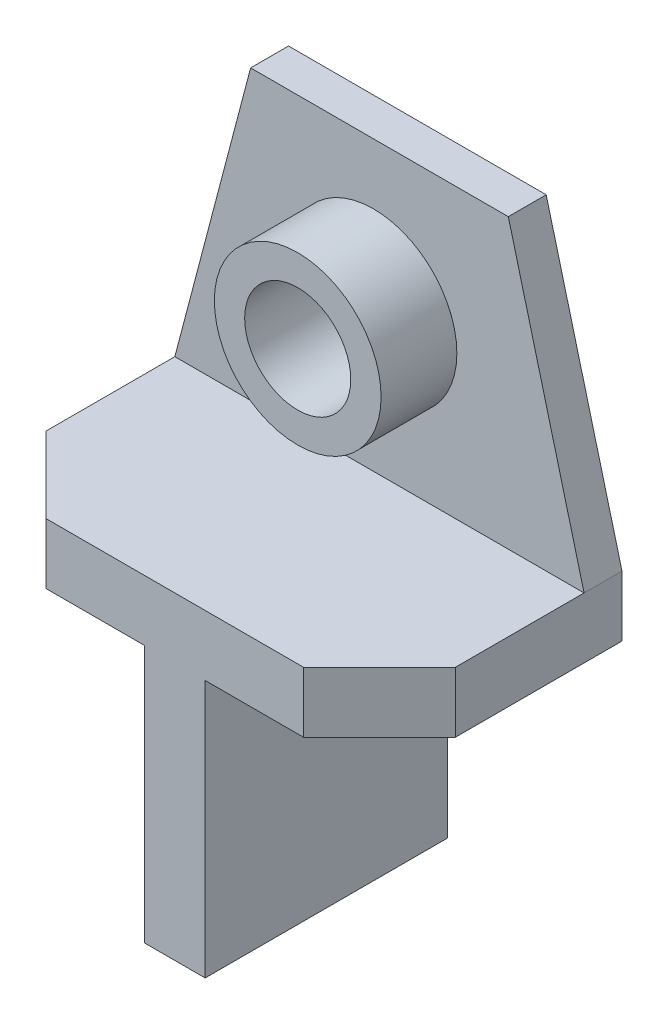
ISO-10303-21;
HEADER;
FILE_DESCRIPTION(('STEP AP214'),'2;1');
FILE_NAME('part.step','',(''),(''),'','','');
FILE_SCHEMA(('AUTOMOTIVE_DESIGN { 1 0 10303 214 1 1 1 1 }'));
ENDSEC;
DATA;
#1=APPLICATION_CONTEXT('core data for automotive mechanical design processes');
#2=APPLICATION_PROTOCOL_DEFINITION('international standard','automotive_design',2000,#1);
#3=PRODUCT_CONTEXT('',#1,'mechanical');
#4=PRODUCT('Part','Part','',(#3));
#5=PRODUCT_RELATED_PRODUCT_CATEGORY('part','',(#4));
#6=PRODUCT_DEFINITION_FORMATION('','',#4);
#7=PRODUCT_DEFINITION_CONTEXT('part definition',#1,'design');
#8=PRODUCT_DEFINITION('design','',#6,#7);
#9=PRODUCT_DEFINITION_SHAPE('','',#8);
#10=(LENGTH_UNIT() NAMED_UNIT(*) SI_UNIT(.MILLI.,.METRE.));
#11=(NAMED_UNIT(*) PLANE_ANGLE_UNIT() SI_UNIT($,.RADIAN.));
#12=(NAMED_UNIT(*) SI_UNIT($,.STERADIAN.) SOLID_ANGLE_UNIT());
#13=UNCERTAINTY_MEASURE_WITH_UNIT(LENGTH_MEASURE(1.E-05),#10,'distance_accuracy_value','');
#14=(GEOMETRIC_REPRESENTATION_CONTEXT(3) GLOBAL_UNCERTAINTY_ASSIGNED_CONTEXT((#13)) GLOBAL_UNIT_ASSIGNED_CONTEXT((#10,
#11,#12)) REPRESENTATION_CONTEXT('',''));
#15=CARTESIAN_POINT('',(0.,0.,0.));
#16=DIRECTION('',(0.,0.,1.));
#17=DIRECTION('',(1.,0.,0.));
#18=AXIS2_PLACEMENT_3D('',#15,#16,#17);
#19=CARTESIAN_POINT('',(-26.2114577752685,9.06177193119013,32.));
#20=DIRECTION('',(0.,-1.,0.));
#21=DIRECTION('',(0.,0.,-1.));
#22=AXIS2_PLACEMENT_3D('',#19,#20,#21);
#23=PLANE('',#22);
#24=DIRECTION('',(1.,0.,0.));
#25=VECTOR('',#24,1.);
#26=CARTESIAN_POINT('',(-26.2114577752685,9.06177193119013,5.));
#27=LINE('',#26,#25);
#28=CARTESIAN_POINT('',(-26.2114577752685,9.06177193119013,5.));
#29=VERTEX_POINT('',#28);
#30=CARTESIAN_POINT('',(27.7885422247315,9.06177193119013,5.));
#31=VERTEX_POINT('',#30);
#32=EDGE_CURVE('E59',#29,#31,#27,.T.);
#33=ORIENTED_EDGE('',*,*,#32,.F.);
#34=DIRECTION('',(0.,0.,-1.));
#35=VECTOR('',#34,1.);
#36=CARTESIAN_POINT('',(-26.2114577752685,9.06177193119013,32.));
#37=LINE('',#36,#35);
#38=CARTESIAN_POINT('',(-26.2114577752685,9.06177193119013,22.));
#39=VERTEX_POINT('',#38);
#40=EDGE_CURVE('E144',#39,#29,#37,.T.);
#41=ORIENTED_EDGE('',*,*,#40,.F.);
#42=DIRECTION('',(-0.707106781186546,0.,-0.707106781186549));
#43=VECTOR('',#42,1.);
#44=CARTESIAN_POINT('',(-16.2114577752685,9.06177193119013,32.));
#45=LINE('',#44,#43);
#46=CARTESIAN_POINT('',(-16.2114577752685,9.06177193119013,32.));
#47=VERTEX_POINT('',#46);
#48=EDGE_CURVE('E11',#39,#47,#45,.F.);
#49=ORIENTED_EDGE('',*,*,#48,.T.);
#50=DIRECTION('',(-1.,0.,0.));
#51=VECTOR('',#50,1.);
#52=CARTESIAN_POINT('',(-26.2114577752685,9.06177193119013,32.));
#53=LINE('',#52,#51);
#54=CARTESIAN_POINT('',(17.7885422247315,9.06177193119013,32.));
#55=VERTEX_POINT('',#54);
#56=EDGE_CURVE('E211',#55,#47,#53,.T.);
#57=ORIENTED_EDGE('',*,*,#56,.F.);
#58=DIRECTION('',(-0.707106781186546,0.,0.707106781186549));
#59=VECTOR('',#58,1.);
#60=CARTESIAN_POINT('',(17.7885422247315,9.06177193119013,32.));
#61=LINE('',#60,#59);
#62=CARTESIAN_POINT('',(27.7885422247315,9.06177193119013,22.));
#63=VERTEX_POINT('',#62);
#64=EDGE_CURVE('E139',#55,#63,#61,.F.);
#65=ORIENTED_EDGE('',*,*,#64,.T.);
#66=DIRECTION('',(0.,0.,-1.));
#67=VECTOR('',#66,1.);
#68=CARTESIAN_POINT('',(27.7885422247315,9.06177193119013,32.));
#69=LINE('',#68,#67);
#70=EDGE_CURVE('E136',#63,#31,#69,.T.);
#71=ORIENTED_EDGE('',*,*,#70,.T.);
#72=EDGE_LOOP('',(#33,#41,#49,#57,#65,#71));
#73=FACE_BOUND('',#72,.T.);
#74=ADVANCED_FACE('F41',(#73),#23,.F.);
#75=CARTESIAN_POINT('',(4.78854222473152,-32.9382280688099,32.));
#76=DIRECTION('',(-1.,0.,0.));
#77=DIRECTION('',(0.,0.,1.));
#78=AXIS2_PLACEMENT_3D('',#75,#76,#77);
#79=PLANE('',#78);
#80=DIRECTION('',(0.,1.,0.));
#81=VECTOR('',#80,1.);
#82=CARTESIAN_POINT('',(4.78854222473152,-32.9382280688099,0.));
#83=LINE('',#82,#81);
#84=CARTESIAN_POINT('',(4.78854222473152,-32.9382280688099,0.));
#85=VERTEX_POINT('',#84);
#86=CARTESIAN_POINT('',(4.78854222473152,1.06177193119013,0.));
#87=VERTEX_POINT('',#86);
#88=EDGE_CURVE('E155',#85,#87,#83,.T.);
#89=ORIENTED_EDGE('',*,*,#88,.T.);
#90=DIRECTION('',(0.,0.,-1.));
#91=VECTOR('',#90,1.);
#92=CARTESIAN_POINT('',(4.78854222473152,1.06177193119013,32.));
#93=LINE('',#92,#91);
#94=CARTESIAN_POINT('',(4.78854222473152,1.06177193119013,32.));
#95=VERTEX_POINT('',#94);
#96=EDGE_CURVE('E264',#95,#87,#93,.T.);
#97=ORIENTED_EDGE('',*,*,#96,.F.);
#98=DIRECTION('',(0.,1.,0.));
#99=VECTOR('',#98,1.);
#100=CARTESIAN_POINT('',(4.78854222473152,-32.9382280688099,32.));
#101=LINE('',#100,#99);
#102=CARTESIAN_POINT('',(4.78854222473152,-32.9382280688099,32.));
#103=VERTEX_POINT('',#102);
#104=EDGE_CURVE('E202',#103,#95,#101,.T.);
#105=ORIENTED_EDGE('',*,*,#104,.F.);
#106=DIRECTION('',(0.,0.,-1.));
#107=VECTOR('',#106,1.);
#108=CARTESIAN_POINT('',(4.78854222473152,-32.9382280688099,32.));
#109=LINE('',#108,#107);
#110=EDGE_CURVE('E224',#103,#85,#109,.T.);
#111=ORIENTED_EDGE('',*,*,#110,.T.);
#112=EDGE_LOOP('',(#89,#97,#105,#111));
#113=FACE_BOUND('',#112,.T.);
#114=ADVANCED_FACE('F330',(#113),#79,.F.);
#115=CARTESIAN_POINT('',(4.78854222473152,1.06177193119013,32.));
#116=DIRECTION('',(0.,1.,0.));
#117=DIRECTION('',(-1.,0.,0.));
#118=AXIS2_PLACEMENT_3D('',#115,#116,#117);
#119=PLANE('',#118);
#120=DIRECTION('',(0.,0.,-1.));
#121=VECTOR('',#120,1.);
#122=CARTESIAN_POINT('',(27.7885422247315,1.06177193119012,32.));
#123=LINE('',#122,#121);
#124=CARTESIAN_POINT('',(27.7885422247315,1.06177193119012,22.));
#125=VERTEX_POINT('',#124);
#126=CARTESIAN_POINT('',(27.7885422247315,1.06177193119012,0.));
#127=VERTEX_POINT('',#126);
#128=EDGE_CURVE('E143',#125,#127,#123,.T.);
#129=ORIENTED_EDGE('',*,*,#128,.F.);
#130=DIRECTION('',(0.707106781186546,0.,-0.707106781186549));
#131=VECTOR('',#130,1.);
#132=CARTESIAN_POINT('',(17.7885422247315,1.06177193119012,32.));
#133=LINE('',#132,#131);
#134=CARTESIAN_POINT('',(17.7885422247315,1.06177193119012,32.));
#135=VERTEX_POINT('',#134);
#136=EDGE_CURVE('E277',#125,#135,#133,.F.);
#137=ORIENTED_EDGE('',*,*,#136,.T.);
#138=DIRECTION('',(1.,0.,0.));
#139=VECTOR('',#138,1.);
#140=CARTESIAN_POINT('',(4.78854222473152,1.06177193119013,32.));
#141=LINE('',#140,#139);
#142=EDGE_CURVE('E206',#95,#135,#141,.T.);
#143=ORIENTED_EDGE('',*,*,#142,.F.);
#144=ORIENTED_EDGE('',*,*,#96,.T.);
#145=DIRECTION('',(1.,0.,0.));
#146=VECTOR('',#145,1.);
#147=CARTESIAN_POINT('',(4.78854222473152,1.06177193119013,0.));
#148=LINE('',#147,#146);
#149=EDGE_CURVE('E228',#87,#127,#148,.T.);
#150=ORIENTED_EDGE('',*,*,#149,.T.);
#151=EDGE_LOOP('',(#129,#137,#143,#144,#150));
#152=FACE_BOUND('',#151,.T.);
#153=ADVANCED_FACE('F306',(#152),#119,.F.);
#154=CARTESIAN_POINT('',(27.7885422247315,9.06177193119013,32.));
#155=DIRECTION('',(-1.,0.,0.));
#156=DIRECTION('',(0.,0.,1.));
#157=AXIS2_PLACEMENT_3D('',#154,#155,#156);
#158=PLANE('',#157);
#159=ORIENTED_EDGE('',*,*,#70,.F.);
#160=DIRECTION('',(0.,-1.,0.));
#161=VECTOR('',#160,1.);
#162=CARTESIAN_POINT('',(27.7885422247315,9.06177193119013,22.));
#163=LINE('',#162,#161);
#164=EDGE_CURVE('E274',#63,#125,#163,.T.);
#165=ORIENTED_EDGE('',*,*,#164,.T.);
#166=ORIENTED_EDGE('',*,*,#128,.T.);
#167=DIRECTION('',(0.,1.,0.));
#168=VECTOR('',#167,1.);
#169=CARTESIAN_POINT('',(27.7885422247315,9.06177193119013,0.));
#170=LINE('',#169,#168);
#171=CARTESIAN_POINT('',(27.7885422247315,9.06177193119013,0.));
#172=VERTEX_POINT('',#171);
#173=EDGE_CURVE('E151',#127,#172,#170,.T.);
#174=ORIENTED_EDGE('',*,*,#173,.T.);
#175=DIRECTION('',(0.,0.,-1.));
#176=VECTOR('',#175,1.);
#177=CARTESIAN_POINT('',(27.7885422247315,9.06177193119013,5.));
#178=LINE('',#177,#176);
#179=EDGE_CURVE('E147',#31,#172,#178,.T.);
#180=ORIENTED_EDGE('',*,*,#179,.F.);
#181=EDGE_LOOP('',(#159,#165,#166,#174,#180));
#182=FACE_BOUND('',#181,.T.);
#183=ADVANCED_FACE('F149',(#182),#158,.F.);
#184=CARTESIAN_POINT('',(-26.2114577752685,9.06177193119013,32.));
#185=DIRECTION('',(1.,0.,0.));
#186=DIRECTION('',(0.,0.,-1.));
#187=AXIS2_PLACEMENT_3D('',#184,#185,#186);
#188=PLANE('',#187);
#189=DIRECTION('',(0.,0.,-1.));
#190=VECTOR('',#189,1.);
#191=CARTESIAN_POINT('',(-26.2114577752685,1.06177193119012,32.));
#192=LINE('',#191,#190);
#193=CARTESIAN_POINT('',(-26.2114577752685,1.06177193119012,22.));
#194=VERTEX_POINT('',#193);
#195=CARTESIAN_POINT('',(-26.2114577752685,1.06177193119012,0.));
#196=VERTEX_POINT('',#195);
#197=EDGE_CURVE('E257',#194,#196,#192,.T.);
#198=ORIENTED_EDGE('',*,*,#197,.F.);
#199=DIRECTION('',(0.,1.,0.));
#200=VECTOR('',#199,1.);
#201=CARTESIAN_POINT('',(-26.2114577752685,9.06177193119013,22.));
#202=LINE('',#201,#200);
#203=EDGE_CURVE('E52',#194,#39,#202,.T.);
#204=ORIENTED_EDGE('',*,*,#203,.T.);
#205=ORIENTED_EDGE('',*,*,#40,.T.);
#206=DIRECTION('',(0.,0.,-1.));
#207=VECTOR('',#206,1.);
#208=CARTESIAN_POINT('',(-26.2114577752685,9.06177193119013,5.));
#209=LINE('',#208,#207);
#210=CARTESIAN_POINT('',(-26.2114577752685,9.06177193119013,0.));
#211=VERTEX_POINT('',#210);
#212=EDGE_CURVE('E187',#29,#211,#209,.T.);
#213=ORIENTED_EDGE('',*,*,#212,.T.);
#214=DIRECTION('',(0.,-1.,0.));
#215=VECTOR('',#214,1.);
#216=CARTESIAN_POINT('',(-26.2114577752685,9.06177193119013,0.));
#217=LINE('',#216,#215);
#218=EDGE_CURVE('E234',#211,#196,#217,.T.);
#219=ORIENTED_EDGE('',*,*,#218,.T.);
#220=EDGE_LOOP('',(#198,#204,#205,#213,#219));
#221=FACE_BOUND('',#220,.T.);
#222=ADVANCED_FACE('F294',(#221),#188,.F.);
#223=CARTESIAN_POINT('',(-26.2114577752685,1.06177193119012,32.));
#224=DIRECTION('',(0.,1.,0.));
#225=DIRECTION('',(-1.,0.,0.));
#226=AXIS2_PLACEMENT_3D('',#223,#224,#225);
#227=PLANE('',#226);
#228=DIRECTION('',(1.,0.,0.));
#229=VECTOR('',#228,1.);
#230=CARTESIAN_POINT('',(-26.2114577752685,1.06177193119012,32.));
#231=LINE('',#230,#229);
#232=CARTESIAN_POINT('',(-16.2114577752685,1.06177193119012,32.));
#233=VERTEX_POINT('',#232);
#234=CARTESIAN_POINT('',(-3.21145777526848,1.06177193119013,32.));
#235=VERTEX_POINT('',#234);
#236=EDGE_CURVE('E215',#233,#235,#231,.T.);
#237=ORIENTED_EDGE('',*,*,#236,.F.);
#238=DIRECTION('',(0.707106781186546,0.,0.707106781186549));
#239=VECTOR('',#238,1.);
#240=CARTESIAN_POINT('',(-16.2114577752685,1.06177193119012,32.));
#241=LINE('',#240,#239);
#242=EDGE_CURVE('E284',#233,#194,#241,.F.);
#243=ORIENTED_EDGE('',*,*,#242,.T.);
#244=ORIENTED_EDGE('',*,*,#197,.T.);
#245=DIRECTION('',(1.,0.,0.));
#246=VECTOR('',#245,1.);
#247=CARTESIAN_POINT('',(-26.2114577752685,1.06177193119012,0.));
#248=LINE('',#247,#246);
#249=CARTESIAN_POINT('',(-3.21145777526848,1.06177193119013,0.));
#250=VERTEX_POINT('',#249);
#251=EDGE_CURVE('E238',#196,#250,#248,.T.);
#252=ORIENTED_EDGE('',*,*,#251,.T.);
#253=DIRECTION('',(0.,0.,-1.));
#254=VECTOR('',#253,1.);
#255=CARTESIAN_POINT('',(-3.21145777526848,1.06177193119013,32.));
#256=LINE('',#255,#254);
#257=EDGE_CURVE('E253',#235,#250,#256,.T.);
#258=ORIENTED_EDGE('',*,*,#257,.F.);
#259=EDGE_LOOP('',(#237,#243,#244,#252,#258));
#260=FACE_BOUND('',#259,.T.);
#261=ADVANCED_FACE('F290',(#260),#227,.F.);
#262=CARTESIAN_POINT('',(-3.21145777526848,-32.9382280688099,32.));
#263=DIRECTION('',(1.,0.,0.));
#264=DIRECTION('',(0.,1.,0.));
#265=AXIS2_PLACEMENT_3D('',#262,#263,#264);
#266=PLANE('',#265);
#267=DIRECTION('',(0.,-1.,0.));
#268=VECTOR('',#267,1.);
#269=CARTESIAN_POINT('',(-3.21145777526848,-32.9382280688099,0.));
#270=LINE('',#269,#268);
#271=CARTESIAN_POINT('',(-3.21145777526848,-32.9382280688099,0.));
#272=VERTEX_POINT('',#271);
#273=EDGE_CURVE('E241',#250,#272,#270,.T.);
#274=ORIENTED_EDGE('',*,*,#273,.T.);
#275=DIRECTION('',(0.,0.,-1.));
#276=VECTOR('',#275,1.);
#277=CARTESIAN_POINT('',(-3.21145777526848,-32.9382280688099,32.));
#278=LINE('',#277,#276);
#279=CARTESIAN_POINT('',(-3.21145777526848,-32.9382280688099,32.));
#280=VERTEX_POINT('',#279);
#281=EDGE_CURVE('E249',#280,#272,#278,.T.);
#282=ORIENTED_EDGE('',*,*,#281,.F.);
#283=DIRECTION('',(0.,-1.,0.));
#284=VECTOR('',#283,1.);
#285=CARTESIAN_POINT('',(-3.21145777526848,-32.9382280688099,32.));
#286=LINE('',#285,#284);
#287=EDGE_CURVE('E218',#235,#280,#286,.T.);
#288=ORIENTED_EDGE('',*,*,#287,.F.);
#289=ORIENTED_EDGE('',*,*,#257,.T.);
#290=EDGE_LOOP('',(#274,#282,#288,#289));
#291=FACE_BOUND('',#290,.T.);
#292=ADVANCED_FACE('F322',(#291),#266,.F.);
#293=CARTESIAN_POINT('',(4.78854222473152,-32.9382280688099,32.));
#294=DIRECTION('',(0.,1.,0.));
#295=DIRECTION('',(-1.,0.,0.));
#296=AXIS2_PLACEMENT_3D('',#293,#294,#295);
#297=PLANE('',#296);
#298=DIRECTION('',(1.,0.,0.));
#299=VECTOR('',#298,1.);
#300=CARTESIAN_POINT('',(4.78854222473152,-32.9382280688099,0.));
#301=LINE('',#300,#299);
#302=EDGE_CURVE('E207',#272,#85,#301,.T.);
#303=ORIENTED_EDGE('',*,*,#302,.T.);
#304=ORIENTED_EDGE('',*,*,#110,.F.);
#305=DIRECTION('',(1.,0.,0.));
#306=VECTOR('',#305,1.);
#307=CARTESIAN_POINT('',(4.78854222473152,-32.9382280688099,32.));
#308=LINE('',#307,#306);
#309=EDGE_CURVE('E221',#280,#103,#308,.T.);
#310=ORIENTED_EDGE('',*,*,#309,.F.);
#311=ORIENTED_EDGE('',*,*,#281,.T.);
#312=EDGE_LOOP('',(#303,#304,#310,#311));
#313=FACE_BOUND('',#312,.T.);
#314=ADVANCED_FACE('F328',(#313),#297,.F.);
#315=CARTESIAN_POINT('',(0.,0.,32.));
#316=DIRECTION('',(0.,0.,-1.));
#317=DIRECTION('',(-1.,0.,0.));
#318=AXIS2_PLACEMENT_3D('',#315,#316,#317);
#319=PLANE('',#318);
#320=ORIENTED_EDGE('',*,*,#56,.T.);
#321=DIRECTION('',(0.,-1.,0.));
#322=VECTOR('',#321,1.);
#323=CARTESIAN_POINT('',(-16.2114577752685,0.,32.));
#324=LINE('',#323,#322);
#325=EDGE_CURVE('E280',#47,#233,#324,.T.);
#326=ORIENTED_EDGE('',*,*,#325,.T.);
#327=ORIENTED_EDGE('',*,*,#236,.T.);
#328=ORIENTED_EDGE('',*,*,#287,.T.);
#329=ORIENTED_EDGE('',*,*,#309,.T.);
#330=ORIENTED_EDGE('',*,*,#104,.T.);
#331=ORIENTED_EDGE('',*,*,#142,.T.);
#332=DIRECTION('',(0.,1.,0.));
#333=VECTOR('',#332,1.);
#334=CARTESIAN_POINT('',(17.7885422247315,0.,32.));
#335=LINE('',#334,#333);
#336=EDGE_CURVE('E268',#135,#55,#335,.T.);
#337=ORIENTED_EDGE('',*,*,#336,.T.);
#338=EDGE_LOOP('',(#320,#326,#327,#328,#329,#330,#331,#337));
#339=FACE_BOUND('',#338,.T.);
#340=ADVANCED_FACE('F299',(#339),#319,.F.);
#341=CARTESIAN_POINT('',(0.,0.,0.));
#342=DIRECTION('',(0.,0.,-1.));
#343=DIRECTION('',(-1.,0.,0.));
#344=AXIS2_PLACEMENT_3D('',#341,#342,#343);
#345=PLANE('',#344);
#346=CARTESIAN_POINT('',(0.,28.0617719311901,0.));
#347=DIRECTION('',(0.,0.,-1.));
#348=DIRECTION('',(-1.,0.,0.));
#349=AXIS2_PLACEMENT_3D('',#346,#347,#348);
#350=CIRCLE('',#349,7.);
#351=CARTESIAN_POINT('',(-7.,28.0617719311901,0.));
#352=VERTEX_POINT('',#351);
#353=EDGE_CURVE('E46',#352,#352,#350,.T.);
#354=ORIENTED_EDGE('',*,*,#353,.F.);
#355=EDGE_LOOP('',(#354));
#356=FACE_BOUND('',#355,.T.);
#357=ORIENTED_EDGE('',*,*,#88,.F.);
#358=ORIENTED_EDGE('',*,*,#302,.F.);
#359=ORIENTED_EDGE('',*,*,#273,.F.);
#360=ORIENTED_EDGE('',*,*,#251,.F.);
#361=ORIENTED_EDGE('',*,*,#218,.F.);
#362=DIRECTION('',(-0.254493299279644,-0.967074537262646,0.));
#363=VECTOR('',#362,1.);
#364=CARTESIAN_POINT('',(-16.2114577752685,47.0617719311901,0.));
#365=LINE('',#364,#363);
#366=CARTESIAN_POINT('',(-16.2114577752685,47.0617719311901,0.));
#367=VERTEX_POINT('',#366);
#368=EDGE_CURVE('E173',#367,#211,#365,.T.);
#369=ORIENTED_EDGE('',*,*,#368,.F.);
#370=DIRECTION('',(-1.,0.,0.));
#371=VECTOR('',#370,1.);
#372=CARTESIAN_POINT('',(17.7885422247315,47.0617719311901,0.));
#373=LINE('',#372,#371);
#374=CARTESIAN_POINT('',(17.7885422247315,47.0617719311901,0.));
#375=VERTEX_POINT('',#374);
#376=EDGE_CURVE('E177',#375,#367,#373,.T.);
#377=ORIENTED_EDGE('',*,*,#376,.F.);
#378=DIRECTION('',(-0.254493299279644,0.967074537262646,0.));
#379=VECTOR('',#378,1.);
#380=CARTESIAN_POINT('',(27.7885422247315,9.06177193119013,0.));
#381=LINE('',#380,#379);
#382=EDGE_CURVE('E188',#172,#375,#381,.T.);
#383=ORIENTED_EDGE('',*,*,#382,.F.);
#384=ORIENTED_EDGE('',*,*,#173,.F.);
#385=ORIENTED_EDGE('',*,*,#149,.F.);
#386=EDGE_LOOP('',(#357,#358,#359,#360,#361,#369,#377,#383,#384,#385));
#387=FACE_BOUND('',#386,.T.);
#388=ADVANCED_FACE('F310',(#356,#387),#345,.T.);
#389=CARTESIAN_POINT('',(17.7885422247315,0.,32.));
#390=DIRECTION('',(-0.707106781186549,0.,-0.707106781186546));
#391=DIRECTION('',(0.,1.,0.));
#392=AXIS2_PLACEMENT_3D('',#389,#390,#391);
#393=PLANE('',#392);
#394=ORIENTED_EDGE('',*,*,#136,.F.);
#395=ORIENTED_EDGE('',*,*,#164,.F.);
#396=ORIENTED_EDGE('',*,*,#64,.F.);
#397=ORIENTED_EDGE('',*,*,#336,.F.);
#398=EDGE_LOOP('',(#394,#395,#396,#397));
#399=FACE_BOUND('',#398,.T.);
#400=ADVANCED_FACE('F303',(#399),#393,.F.);
#401=CARTESIAN_POINT('',(-16.2114577752685,0.,32.));
#402=DIRECTION('',(0.707106781186549,0.,-0.707106781186546));
#403=DIRECTION('',(0.,-1.,0.));
#404=AXIS2_PLACEMENT_3D('',#401,#402,#403);
#405=PLANE('',#404);
#406=ORIENTED_EDGE('',*,*,#48,.F.);
#407=ORIENTED_EDGE('',*,*,#203,.F.);
#408=ORIENTED_EDGE('',*,*,#242,.F.);
#409=ORIENTED_EDGE('',*,*,#325,.F.);
#410=EDGE_LOOP('',(#406,#407,#408,#409));
#411=FACE_BOUND('',#410,.T.);
#412=ADVANCED_FACE('F44',(#411),#405,.F.);
#413=CARTESIAN_POINT('',(27.7885422247315,9.06177193119013,5.));
#414=DIRECTION('',(-0.967074537262646,-0.254493299279644,0.));
#415=DIRECTION('',(0.254493299279644,-0.967074537262647,0.));
#416=AXIS2_PLACEMENT_3D('',#413,#414,#415);
#417=PLANE('',#416);
#418=ORIENTED_EDGE('',*,*,#382,.T.);
#419=DIRECTION('',(0.,0.,-1.));
#420=VECTOR('',#419,1.);
#421=CARTESIAN_POINT('',(17.7885422247315,47.0617719311901,5.));
#422=LINE('',#421,#420);
#423=CARTESIAN_POINT('',(17.7885422247315,47.0617719311901,5.));
#424=VERTEX_POINT('',#423);
#425=EDGE_CURVE('E156',#424,#375,#422,.T.);
#426=ORIENTED_EDGE('',*,*,#425,.F.);
#427=DIRECTION('',(-0.254493299279644,0.967074537262646,0.));
#428=VECTOR('',#427,1.);
#429=CARTESIAN_POINT('',(27.7885422247315,9.06177193119013,5.));
#430=LINE('',#429,#428);
#431=EDGE_CURVE('E159',#31,#424,#430,.T.);
#432=ORIENTED_EDGE('',*,*,#431,.F.);
#433=ORIENTED_EDGE('',*,*,#179,.T.);
#434=EDGE_LOOP('',(#418,#426,#432,#433));
#435=FACE_BOUND('',#434,.T.);
#436=ADVANCED_FACE('F160',(#435),#417,.F.);
#437=CARTESIAN_POINT('',(17.7885422247315,47.0617719311901,5.));
#438=DIRECTION('',(0.,-1.,0.));
#439=DIRECTION('',(0.,0.,-1.));
#440=AXIS2_PLACEMENT_3D('',#437,#438,#439);
#441=PLANE('',#440);
#442=ORIENTED_EDGE('',*,*,#376,.T.);
#443=DIRECTION('',(0.,0.,-1.));
#444=VECTOR('',#443,1.);
#445=CARTESIAN_POINT('',(-16.2114577752685,47.0617719311901,5.));
#446=LINE('',#445,#444);
#447=CARTESIAN_POINT('',(-16.2114577752685,47.0617719311901,5.));
#448=VERTEX_POINT('',#447);
#449=EDGE_CURVE('E196',#448,#367,#446,.T.);
#450=ORIENTED_EDGE('',*,*,#449,.F.);
#451=DIRECTION('',(-1.,0.,0.));
#452=VECTOR('',#451,1.);
#453=CARTESIAN_POINT('',(17.7885422247315,47.0617719311901,5.));
#454=LINE('',#453,#452);
#455=EDGE_CURVE('E165',#424,#448,#454,.T.);
#456=ORIENTED_EDGE('',*,*,#455,.F.);
#457=ORIENTED_EDGE('',*,*,#425,.T.);
#458=EDGE_LOOP('',(#442,#450,#456,#457));
#459=FACE_BOUND('',#458,.T.);
#460=ADVANCED_FACE('F314',(#459),#441,.F.);
#461=CARTESIAN_POINT('',(-16.2114577752685,47.0617719311901,5.));
#462=DIRECTION('',(0.967074537262646,-0.254493299279644,0.));
#463=DIRECTION('',(0.254493299279644,0.967074537262647,0.));
#464=AXIS2_PLACEMENT_3D('',#461,#462,#463);
#465=PLANE('',#464);
#466=ORIENTED_EDGE('',*,*,#368,.T.);
#467=ORIENTED_EDGE('',*,*,#212,.F.);
#468=DIRECTION('',(-0.254493299279644,-0.967074537262646,0.));
#469=VECTOR('',#468,1.);
#470=CARTESIAN_POINT('',(-16.2114577752685,47.0617719311901,5.));
#471=LINE('',#470,#469);
#472=EDGE_CURVE('E170',#448,#29,#471,.T.);
#473=ORIENTED_EDGE('',*,*,#472,.F.);
#474=ORIENTED_EDGE('',*,*,#449,.T.);
#475=EDGE_LOOP('',(#466,#467,#473,#474));
#476=FACE_BOUND('',#475,.T.);
#477=ADVANCED_FACE('F317',(#476),#465,.F.);
#478=CARTESIAN_POINT('',(0.,0.,5.));
#479=DIRECTION('',(0.,0.,1.));
#480=DIRECTION('',(1.,0.,0.));
#481=AXIS2_PLACEMENT_3D('',#478,#479,#480);
#482=PLANE('',#481);
#483=CARTESIAN_POINT('',(0.,28.0617719311901,5.));
#484=DIRECTION('',(0.,0.,1.));
#485=DIRECTION('',(1.,0.,0.));
#486=AXIS2_PLACEMENT_3D('',#483,#484,#485);
#487=CIRCLE('',#486,11.);
#488=CARTESIAN_POINT('',(11.,28.0617719311901,5.));
#489=VERTEX_POINT('',#488);
#490=EDGE_CURVE('E180',#489,#489,#487,.T.);
#491=ORIENTED_EDGE('',*,*,#490,.F.);
#492=EDGE_LOOP('',(#491));
#493=FACE_BOUND('',#492,.T.);
#494=ORIENTED_EDGE('',*,*,#32,.T.);
#495=ORIENTED_EDGE('',*,*,#431,.T.);
#496=ORIENTED_EDGE('',*,*,#455,.T.);
#497=ORIENTED_EDGE('',*,*,#472,.T.);
#498=EDGE_LOOP('',(#494,#495,#496,#497));
#499=FACE_BOUND('',#498,.T.);
#500=ADVANCED_FACE('F168',(#493,#499),#482,.T.);
#501=CARTESIAN_POINT('',(0.,28.0617719311901,15.));
#502=DIRECTION('',(0.,0.,1.));
#503=DIRECTION('',(1.,0.,0.));
#504=AXIS2_PLACEMENT_3D('',#501,#502,#503);
#505=PLANE('',#504);
#506=CARTESIAN_POINT('',(0.,28.0617719311901,15.));
#507=DIRECTION('',(0.,0.,1.));
#508=DIRECTION('',(1.,0.,0.));
#509=AXIS2_PLACEMENT_3D('',#506,#507,#508);
#510=CIRCLE('',#509,11.);
#511=CARTESIAN_POINT('',(11.,28.0617719311901,15.));
#512=VERTEX_POINT('',#511);
#513=EDGE_CURVE('E191',#512,#512,#510,.T.);
#514=ORIENTED_EDGE('',*,*,#513,.T.);
#515=EDGE_LOOP('',(#514));
#516=FACE_BOUND('',#515,.T.);
#517=CARTESIAN_POINT('',(0.,28.0617719311901,15.));
#518=DIRECTION('',(0.,0.,1.));
#519=DIRECTION('',(1.,0.,0.));
#520=AXIS2_PLACEMENT_3D('',#517,#518,#519);
#521=CIRCLE('',#520,7.);
#522=CARTESIAN_POINT('',(7.,28.0617719311901,15.));
#523=VERTEX_POINT('',#522);
#524=EDGE_CURVE('E481',#523,#523,#521,.T.);
#525=ORIENTED_EDGE('',*,*,#524,.F.);
#526=EDGE_LOOP('',(#525));
#527=FACE_BOUND('',#526,.T.);
#528=ADVANCED_FACE('F441',(#516,#527),#505,.T.);
#529=CARTESIAN_POINT('',(0.,28.0617719311901,15.));
#530=DIRECTION('',(0.,0.,-1.));
#531=DIRECTION('',(-1.,0.,0.));
#532=AXIS2_PLACEMENT_3D('',#529,#530,#531);
#533=CYLINDRICAL_SURFACE('',#532,11.);
#534=ORIENTED_EDGE('',*,*,#513,.F.);
#535=EDGE_LOOP('',(#534));
#536=FACE_BOUND('',#535,.T.);
#537=ORIENTED_EDGE('',*,*,#490,.T.);
#538=EDGE_LOOP('',(#537));
#539=FACE_BOUND('',#538,.T.);
#540=ADVANCED_FACE('F450',(#536,#539),#533,.T.);
#541=CARTESIAN_POINT('',(0.,28.0617719311901,15.));
#542=DIRECTION('',(0.,0.,-1.));
#543=DIRECTION('',(-1.,0.,0.));
#544=AXIS2_PLACEMENT_3D('',#541,#542,#543);
#545=CYLINDRICAL_SURFACE('',#544,7.);
#546=ORIENTED_EDGE('',*,*,#524,.T.);
#547=EDGE_LOOP('',(#546));
#548=FACE_BOUND('',#547,.T.);
#549=ORIENTED_EDGE('',*,*,#353,.T.);
#550=EDGE_LOOP('',(#549));
#551=FACE_BOUND('',#550,.T.);
#552=ADVANCED_FACE('F458',(#548,#551),#545,.F.);
#553=CLOSED_SHELL('',(#74,#114,#153,#183,#222,#261,#292,#314,#340,#388,#400,#412,#436,#460,#477,
#500,#528,#540,#552));
#554=MANIFOLD_SOLID_BREP('B2',#553);
#555=ADVANCED_BREP_SHAPE_REPRESENTATION('',(#18,#554),#14);
#556=SHAPE_DEFINITION_REPRESENTATION(#9,#555);
ENDSEC;
END-ISO-10303-21;
